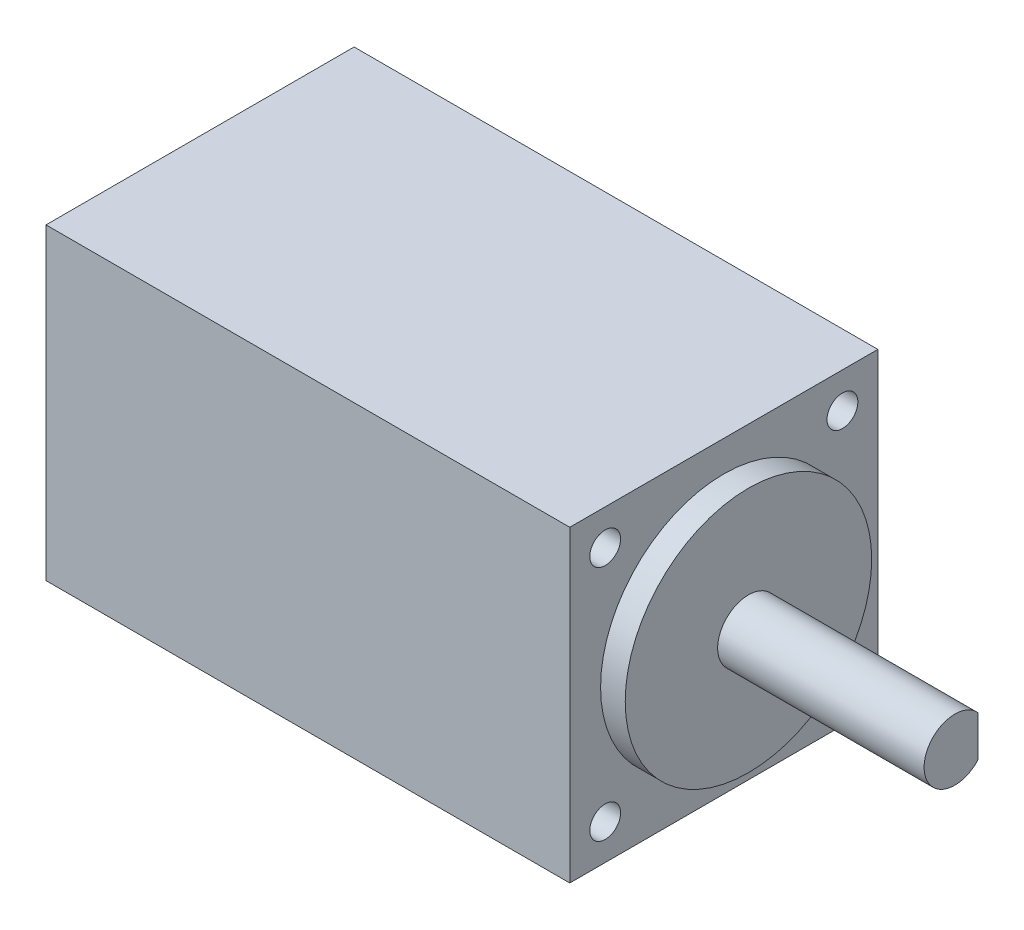
ISO-10303-21;
HEADER;
FILE_DESCRIPTION(('STEP AP214'),'2;1');
FILE_NAME('part.step','',(''),(''),'','','');
FILE_SCHEMA(('AUTOMOTIVE_DESIGN { 1 0 10303 214 1 1 1 1 }'));
ENDSEC;
DATA;
#1=APPLICATION_CONTEXT('core data for automotive mechanical design processes');
#2=APPLICATION_PROTOCOL_DEFINITION('international standard','automotive_design',2000,#1);
#3=PRODUCT_CONTEXT('',#1,'mechanical');
#4=PRODUCT('Part','Part','',(#3));
#5=PRODUCT_RELATED_PRODUCT_CATEGORY('part','',(#4));
#6=PRODUCT_DEFINITION_FORMATION('','',#4);
#7=PRODUCT_DEFINITION_CONTEXT('part definition',#1,'design');
#8=PRODUCT_DEFINITION('design','',#6,#7);
#9=PRODUCT_DEFINITION_SHAPE('','',#8);
#10=(LENGTH_UNIT() NAMED_UNIT(*) SI_UNIT(.MILLI.,.METRE.));
#11=(NAMED_UNIT(*) PLANE_ANGLE_UNIT() SI_UNIT($,.RADIAN.));
#12=(NAMED_UNIT(*) SI_UNIT($,.STERADIAN.) SOLID_ANGLE_UNIT());
#13=UNCERTAINTY_MEASURE_WITH_UNIT(LENGTH_MEASURE(1.E-05),#10,'distance_accuracy_value','');
#14=(GEOMETRIC_REPRESENTATION_CONTEXT(3) GLOBAL_UNCERTAINTY_ASSIGNED_CONTEXT((#13)) GLOBAL_UNIT_ASSIGNED_CONTEXT((#10,
#11,#12)) REPRESENTATION_CONTEXT('',''));
#15=CARTESIAN_POINT('',(0.,0.,0.));
#16=DIRECTION('',(0.,0.,1.));
#17=DIRECTION('',(1.,0.,0.));
#18=AXIS2_PLACEMENT_3D('',#15,#16,#17);
#19=CARTESIAN_POINT('',(49.,10.,-10.));
#20=DIRECTION('',(-1.,0.,0.));
#21=DIRECTION('',(0.,0.,1.));
#22=AXIS2_PLACEMENT_3D('',#19,#20,#21);
#23=CYLINDRICAL_SURFACE('',#22,2.);
#24=CARTESIAN_POINT('',(35.6,10.,-10.));
#25=DIRECTION('',(1.,0.,0.));
#26=DIRECTION('',(0.,0.,-1.));
#27=AXIS2_PLACEMENT_3D('',#24,#25,#26);
#28=CIRCLE('',#27,2.);
#29=CARTESIAN_POINT('',(35.6,10.,-12.));
#30=VERTEX_POINT('',#29);
#31=EDGE_CURVE('E11',#30,#30,#28,.T.);
#32=ORIENTED_EDGE('',*,*,#31,.T.);
#33=EDGE_LOOP('',(#32));
#34=FACE_BOUND('',#33,.T.);
#35=DIRECTION('',(1.,0.,0.));
#36=VECTOR('',#35,1.);
#37=CARTESIAN_POINT('',(40.,8.67712434446771,-11.5));
#38=LINE('',#37,#36);
#39=CARTESIAN_POINT('',(40.,8.67712434446771,-11.5));
#40=VERTEX_POINT('',#39);
#41=CARTESIAN_POINT('',(49.,8.67712434446771,-11.5));
#42=VERTEX_POINT('',#41);
#43=EDGE_CURVE('E103',#40,#42,#38,.T.);
#44=ORIENTED_EDGE('',*,*,#43,.T.);
#45=CARTESIAN_POINT('',(49.,10.,-10.));
#46=DIRECTION('',(1.,0.,0.));
#47=DIRECTION('',(0.,0.,-1.));
#48=AXIS2_PLACEMENT_3D('',#45,#46,#47);
#49=CIRCLE('',#48,2.);
#50=CARTESIAN_POINT('',(49.,11.3228756555323,-11.5));
#51=VERTEX_POINT('',#50);
#52=EDGE_CURVE('E126',#51,#42,#49,.T.);
#53=ORIENTED_EDGE('',*,*,#52,.F.);
#54=DIRECTION('',(1.,0.,0.));
#55=VECTOR('',#54,1.);
#56=CARTESIAN_POINT('',(40.,11.3228756555323,-11.5));
#57=LINE('',#56,#55);
#58=CARTESIAN_POINT('',(40.,11.3228756555323,-11.5));
#59=VERTEX_POINT('',#58);
#60=EDGE_CURVE('E57',#59,#51,#57,.T.);
#61=ORIENTED_EDGE('',*,*,#60,.F.);
#62=CARTESIAN_POINT('',(40.,10.,-10.));
#63=DIRECTION('',(1.,0.,0.));
#64=DIRECTION('',(0.,0.,-1.));
#65=AXIS2_PLACEMENT_3D('',#62,#63,#64);
#66=CIRCLE('',#65,2.);
#67=EDGE_CURVE('E114',#40,#59,#66,.T.);
#68=ORIENTED_EDGE('',*,*,#67,.F.);
#69=EDGE_LOOP('',(#44,#53,#61,#68));
#70=FACE_BOUND('',#69,.T.);
#71=ADVANCED_FACE('F39',(#34,#70),#23,.T.);
#72=CARTESIAN_POINT('',(49.,10.,-10.));
#73=DIRECTION('',(1.,0.,0.));
#74=DIRECTION('',(0.,0.,-1.));
#75=AXIS2_PLACEMENT_3D('',#72,#73,#74);
#76=PLANE('',#75);
#77=ORIENTED_EDGE('',*,*,#52,.T.);
#78=DIRECTION('',(0.,1.,0.));
#79=VECTOR('',#78,1.);
#80=CARTESIAN_POINT('',(49.,0.,-11.5));
#81=LINE('',#80,#79);
#82=EDGE_CURVE('E108',#42,#51,#81,.T.);
#83=ORIENTED_EDGE('',*,*,#82,.T.);
#84=EDGE_LOOP('',(#77,#83));
#85=FACE_BOUND('',#84,.T.);
#86=ADVANCED_FACE('F217',(#85),#76,.T.);
#87=CARTESIAN_POINT('',(34.,0.,0.));
#88=DIRECTION('',(-1.,0.,0.));
#89=DIRECTION('',(0.,0.,1.));
#90=AXIS2_PLACEMENT_3D('',#87,#88,#89);
#91=PLANE('',#90);
#92=CARTESIAN_POINT('',(34.,10.,-10.));
#93=DIRECTION('',(1.,0.,0.));
#94=DIRECTION('',(0.,0.,-1.));
#95=AXIS2_PLACEMENT_3D('',#92,#93,#94);
#96=CIRCLE('',#95,8.);
#97=CARTESIAN_POINT('',(34.,10.,-18.));
#98=VERTEX_POINT('',#97);
#99=EDGE_CURVE('E49',#98,#98,#96,.T.);
#100=ORIENTED_EDGE('',*,*,#99,.F.);
#101=EDGE_LOOP('',(#100));
#102=FACE_BOUND('',#101,.T.);
#103=DIRECTION('',(0.,-1.,0.));
#104=VECTOR('',#103,1.);
#105=CARTESIAN_POINT('',(34.,0.,0.));
#106=LINE('',#105,#104);
#107=CARTESIAN_POINT('',(34.,20.,0.));
#108=VERTEX_POINT('',#107);
#109=CARTESIAN_POINT('',(34.,0.,0.));
#110=VERTEX_POINT('',#109);
#111=EDGE_CURVE('E170',#108,#110,#106,.T.);
#112=ORIENTED_EDGE('',*,*,#111,.T.);
#113=DIRECTION('',(0.,0.,-1.));
#114=VECTOR('',#113,1.);
#115=CARTESIAN_POINT('',(34.,0.,0.));
#116=LINE('',#115,#114);
#117=CARTESIAN_POINT('',(34.,0.,-20.));
#118=VERTEX_POINT('',#117);
#119=EDGE_CURVE('E95',#110,#118,#116,.T.);
#120=ORIENTED_EDGE('',*,*,#119,.T.);
#121=DIRECTION('',(0.,1.,0.));
#122=VECTOR('',#121,1.);
#123=CARTESIAN_POINT('',(34.,0.,-20.));
#124=LINE('',#123,#122);
#125=CARTESIAN_POINT('',(34.,20.,-20.));
#126=VERTEX_POINT('',#125);
#127=EDGE_CURVE('E175',#118,#126,#124,.T.);
#128=ORIENTED_EDGE('',*,*,#127,.T.);
#129=DIRECTION('',(0.,0.,1.));
#130=VECTOR('',#129,1.);
#131=CARTESIAN_POINT('',(34.,20.,0.));
#132=LINE('',#131,#130);
#133=EDGE_CURVE('E66',#126,#108,#132,.T.);
#134=ORIENTED_EDGE('',*,*,#133,.T.);
#135=EDGE_LOOP('',(#112,#120,#128,#134));
#136=FACE_BOUND('',#135,.T.);
#137=CARTESIAN_POINT('',(34.,17.7,-2.3));
#138=DIRECTION('',(1.,0.,0.));
#139=DIRECTION('',(0.,0.,-1.));
#140=AXIS2_PLACEMENT_3D('',#137,#138,#139);
#141=CIRCLE('',#140,1.);
#142=CARTESIAN_POINT('',(34.,17.7,-3.3));
#143=VERTEX_POINT('',#142);
#144=EDGE_CURVE('E162',#143,#143,#141,.T.);
#145=ORIENTED_EDGE('',*,*,#144,.F.);
#146=EDGE_LOOP('',(#145));
#147=FACE_BOUND('',#146,.T.);
#148=CARTESIAN_POINT('',(34.,17.7,-17.7));
#149=DIRECTION('',(1.,0.,0.));
#150=DIRECTION('',(0.,0.,-1.));
#151=AXIS2_PLACEMENT_3D('',#148,#149,#150);
#152=CIRCLE('',#151,1.);
#153=CARTESIAN_POINT('',(34.,17.7,-18.7));
#154=VERTEX_POINT('',#153);
#155=EDGE_CURVE('E154',#154,#154,#152,.T.);
#156=ORIENTED_EDGE('',*,*,#155,.F.);
#157=EDGE_LOOP('',(#156));
#158=FACE_BOUND('',#157,.T.);
#159=CARTESIAN_POINT('',(34.,2.3,-2.3));
#160=DIRECTION('',(1.,0.,0.));
#161=DIRECTION('',(0.,0.,-1.));
#162=AXIS2_PLACEMENT_3D('',#159,#160,#161);
#163=CIRCLE('',#162,1.);
#164=CARTESIAN_POINT('',(34.,2.3,-3.3));
#165=VERTEX_POINT('',#164);
#166=EDGE_CURVE('E146',#165,#165,#163,.T.);
#167=ORIENTED_EDGE('',*,*,#166,.F.);
#168=EDGE_LOOP('',(#167));
#169=FACE_BOUND('',#168,.T.);
#170=CARTESIAN_POINT('',(34.,2.29856671593075,-17.6999999999999));
#171=DIRECTION('',(1.,0.,0.));
#172=DIRECTION('',(0.,0.,-1.));
#173=AXIS2_PLACEMENT_3D('',#170,#171,#172);
#174=CIRCLE('',#173,1.);
#175=CARTESIAN_POINT('',(34.,2.29856671593075,-18.6999999999999));
#176=VERTEX_POINT('',#175);
#177=EDGE_CURVE('E138',#176,#176,#174,.T.);
#178=ORIENTED_EDGE('',*,*,#177,.F.);
#179=EDGE_LOOP('',(#178));
#180=FACE_BOUND('',#179,.T.);
#181=ADVANCED_FACE('F214',(#102,#136,#147,#158,#169,#180),#91,.F.);
#182=CARTESIAN_POINT('',(0.,0.,0.));
#183=DIRECTION('',(-1.,0.,0.));
#184=DIRECTION('',(0.,0.,1.));
#185=AXIS2_PLACEMENT_3D('',#182,#183,#184);
#186=PLANE('',#185);
#187=CARTESIAN_POINT('',(0.,2.3,-2.3));
#188=DIRECTION('',(1.,0.,0.));
#189=DIRECTION('',(0.,0.,-1.));
#190=AXIS2_PLACEMENT_3D('',#187,#188,#189);
#191=CIRCLE('',#190,1.);
#192=CARTESIAN_POINT('',(0.,2.3,-3.3));
#193=VERTEX_POINT('',#192);
#194=EDGE_CURVE('E142',#193,#193,#191,.T.);
#195=ORIENTED_EDGE('',*,*,#194,.T.);
#196=EDGE_LOOP('',(#195));
#197=FACE_BOUND('',#196,.T.);
#198=CARTESIAN_POINT('',(0.,17.7,-2.3));
#199=DIRECTION('',(1.,0.,0.));
#200=DIRECTION('',(0.,0.,-1.));
#201=AXIS2_PLACEMENT_3D('',#198,#199,#200);
#202=CIRCLE('',#201,1.);
#203=CARTESIAN_POINT('',(0.,17.7,-3.3));
#204=VERTEX_POINT('',#203);
#205=EDGE_CURVE('E158',#204,#204,#202,.T.);
#206=ORIENTED_EDGE('',*,*,#205,.T.);
#207=EDGE_LOOP('',(#206));
#208=FACE_BOUND('',#207,.T.);
#209=DIRECTION('',(0.,-1.,0.));
#210=VECTOR('',#209,1.);
#211=CARTESIAN_POINT('',(0.,0.,0.));
#212=LINE('',#211,#210);
#213=CARTESIAN_POINT('',(0.,20.,0.));
#214=VERTEX_POINT('',#213);
#215=CARTESIAN_POINT('',(0.,0.,0.));
#216=VERTEX_POINT('',#215);
#217=EDGE_CURVE('E166',#214,#216,#212,.T.);
#218=ORIENTED_EDGE('',*,*,#217,.F.);
#219=DIRECTION('',(0.,0.,1.));
#220=VECTOR('',#219,1.);
#221=CARTESIAN_POINT('',(0.,20.,0.));
#222=LINE('',#221,#220);
#223=CARTESIAN_POINT('',(0.,20.,-20.));
#224=VERTEX_POINT('',#223);
#225=EDGE_CURVE('E87',#224,#214,#222,.T.);
#226=ORIENTED_EDGE('',*,*,#225,.F.);
#227=DIRECTION('',(0.,1.,0.));
#228=VECTOR('',#227,1.);
#229=CARTESIAN_POINT('',(0.,0.,-20.));
#230=LINE('',#229,#228);
#231=CARTESIAN_POINT('',(0.,0.,-20.));
#232=VERTEX_POINT('',#231);
#233=EDGE_CURVE('E187',#232,#224,#230,.T.);
#234=ORIENTED_EDGE('',*,*,#233,.F.);
#235=DIRECTION('',(0.,0.,-1.));
#236=VECTOR('',#235,1.);
#237=CARTESIAN_POINT('',(0.,0.,0.));
#238=LINE('',#237,#236);
#239=EDGE_CURVE('E184',#216,#232,#238,.T.);
#240=ORIENTED_EDGE('',*,*,#239,.F.);
#241=EDGE_LOOP('',(#218,#226,#234,#240));
#242=FACE_BOUND('',#241,.T.);
#243=CARTESIAN_POINT('',(0.,17.7,-17.7));
#244=DIRECTION('',(1.,0.,0.));
#245=DIRECTION('',(0.,0.,-1.));
#246=AXIS2_PLACEMENT_3D('',#243,#244,#245);
#247=CIRCLE('',#246,1.);
#248=CARTESIAN_POINT('',(0.,17.7,-18.7));
#249=VERTEX_POINT('',#248);
#250=EDGE_CURVE('E150',#249,#249,#247,.T.);
#251=ORIENTED_EDGE('',*,*,#250,.T.);
#252=EDGE_LOOP('',(#251));
#253=FACE_BOUND('',#252,.T.);
#254=CARTESIAN_POINT('',(0.,2.29856671593075,-17.6999999999999));
#255=DIRECTION('',(1.,0.,0.));
#256=DIRECTION('',(0.,0.,-1.));
#257=AXIS2_PLACEMENT_3D('',#254,#255,#256);
#258=CIRCLE('',#257,1.);
#259=CARTESIAN_POINT('',(0.,2.29856671593075,-18.6999999999999));
#260=VERTEX_POINT('',#259);
#261=EDGE_CURVE('E134',#260,#260,#258,.T.);
#262=ORIENTED_EDGE('',*,*,#261,.T.);
#263=EDGE_LOOP('',(#262));
#264=FACE_BOUND('',#263,.T.);
#265=ADVANCED_FACE('F209',(#197,#208,#242,#253,#264),#186,.T.);
#266=CARTESIAN_POINT('',(34.,0.,0.));
#267=DIRECTION('',(0.,0.,-1.));
#268=DIRECTION('',(-1.,0.,0.));
#269=AXIS2_PLACEMENT_3D('',#266,#267,#268);
#270=PLANE('',#269);
#271=ORIENTED_EDGE('',*,*,#217,.T.);
#272=DIRECTION('',(-1.,0.,0.));
#273=VECTOR('',#272,1.);
#274=CARTESIAN_POINT('',(34.,0.,0.));
#275=LINE('',#274,#273);
#276=EDGE_CURVE('E43',#110,#216,#275,.T.);
#277=ORIENTED_EDGE('',*,*,#276,.F.);
#278=ORIENTED_EDGE('',*,*,#111,.F.);
#279=DIRECTION('',(-1.,0.,0.));
#280=VECTOR('',#279,1.);
#281=CARTESIAN_POINT('',(34.,20.,0.));
#282=LINE('',#281,#280);
#283=EDGE_CURVE('E180',#108,#214,#282,.T.);
#284=ORIENTED_EDGE('',*,*,#283,.T.);
#285=EDGE_LOOP('',(#271,#277,#278,#284));
#286=FACE_BOUND('',#285,.T.);
#287=ADVANCED_FACE('F41',(#286),#270,.F.);
#288=CARTESIAN_POINT('',(34.,0.,0.));
#289=DIRECTION('',(0.,1.,0.));
#290=DIRECTION('',(0.,0.,1.));
#291=AXIS2_PLACEMENT_3D('',#288,#289,#290);
#292=PLANE('',#291);
#293=ORIENTED_EDGE('',*,*,#239,.T.);
#294=DIRECTION('',(-1.,0.,0.));
#295=VECTOR('',#294,1.);
#296=CARTESIAN_POINT('',(34.,0.,-20.));
#297=LINE('',#296,#295);
#298=EDGE_CURVE('E196',#118,#232,#297,.T.);
#299=ORIENTED_EDGE('',*,*,#298,.F.);
#300=ORIENTED_EDGE('',*,*,#119,.F.);
#301=ORIENTED_EDGE('',*,*,#276,.T.);
#302=EDGE_LOOP('',(#293,#299,#300,#301));
#303=FACE_BOUND('',#302,.T.);
#304=ADVANCED_FACE('F204',(#303),#292,.F.);
#305=CARTESIAN_POINT('',(34.,0.,-20.));
#306=DIRECTION('',(0.,0.,1.));
#307=DIRECTION('',(1.,0.,0.));
#308=AXIS2_PLACEMENT_3D('',#305,#306,#307);
#309=PLANE('',#308);
#310=ORIENTED_EDGE('',*,*,#233,.T.);
#311=DIRECTION('',(-1.,0.,0.));
#312=VECTOR('',#311,1.);
#313=CARTESIAN_POINT('',(34.,20.,-20.));
#314=LINE('',#313,#312);
#315=EDGE_CURVE('E194',#126,#224,#314,.T.);
#316=ORIENTED_EDGE('',*,*,#315,.F.);
#317=ORIENTED_EDGE('',*,*,#127,.F.);
#318=ORIENTED_EDGE('',*,*,#298,.T.);
#319=EDGE_LOOP('',(#310,#316,#317,#318));
#320=FACE_BOUND('',#319,.T.);
#321=ADVANCED_FACE('F212',(#320),#309,.F.);
#322=CARTESIAN_POINT('',(34.,20.,0.));
#323=DIRECTION('',(0.,-1.,0.));
#324=DIRECTION('',(0.,0.,-1.));
#325=AXIS2_PLACEMENT_3D('',#322,#323,#324);
#326=PLANE('',#325);
#327=ORIENTED_EDGE('',*,*,#225,.T.);
#328=ORIENTED_EDGE('',*,*,#283,.F.);
#329=ORIENTED_EDGE('',*,*,#133,.F.);
#330=ORIENTED_EDGE('',*,*,#315,.T.);
#331=EDGE_LOOP('',(#327,#328,#329,#330));
#332=FACE_BOUND('',#331,.T.);
#333=ADVANCED_FACE('F213',(#332),#326,.F.);
#334=CARTESIAN_POINT('',(34.,17.7,-2.3));
#335=DIRECTION('',(-1.,0.,0.));
#336=DIRECTION('',(0.,0.,1.));
#337=AXIS2_PLACEMENT_3D('',#334,#335,#336);
#338=CYLINDRICAL_SURFACE('',#337,1.);
#339=ORIENTED_EDGE('',*,*,#144,.T.);
#340=EDGE_LOOP('',(#339));
#341=FACE_BOUND('',#340,.T.);
#342=ORIENTED_EDGE('',*,*,#205,.F.);
#343=EDGE_LOOP('',(#342));
#344=FACE_BOUND('',#343,.T.);
#345=ADVANCED_FACE('F267',(#341,#344),#338,.F.);
#346=CARTESIAN_POINT('',(34.,17.7,-17.7));
#347=DIRECTION('',(-1.,0.,0.));
#348=DIRECTION('',(0.,0.,1.));
#349=AXIS2_PLACEMENT_3D('',#346,#347,#348);
#350=CYLINDRICAL_SURFACE('',#349,1.);
#351=ORIENTED_EDGE('',*,*,#155,.T.);
#352=EDGE_LOOP('',(#351));
#353=FACE_BOUND('',#352,.T.);
#354=ORIENTED_EDGE('',*,*,#250,.F.);
#355=EDGE_LOOP('',(#354));
#356=FACE_BOUND('',#355,.T.);
#357=ADVANCED_FACE('F263',(#353,#356),#350,.F.);
#358=CARTESIAN_POINT('',(34.,2.3,-2.3));
#359=DIRECTION('',(-1.,0.,0.));
#360=DIRECTION('',(0.,0.,1.));
#361=AXIS2_PLACEMENT_3D('',#358,#359,#360);
#362=CYLINDRICAL_SURFACE('',#361,1.);
#363=ORIENTED_EDGE('',*,*,#166,.T.);
#364=EDGE_LOOP('',(#363));
#365=FACE_BOUND('',#364,.T.);
#366=ORIENTED_EDGE('',*,*,#194,.F.);
#367=EDGE_LOOP('',(#366));
#368=FACE_BOUND('',#367,.T.);
#369=ADVANCED_FACE('F232',(#365,#368),#362,.F.);
#370=CARTESIAN_POINT('',(34.,2.29856671593075,-17.6999999999999));
#371=DIRECTION('',(-1.,0.,0.));
#372=DIRECTION('',(0.,0.,1.));
#373=AXIS2_PLACEMENT_3D('',#370,#371,#372);
#374=CYLINDRICAL_SURFACE('',#373,1.);
#375=ORIENTED_EDGE('',*,*,#177,.T.);
#376=EDGE_LOOP('',(#375));
#377=FACE_BOUND('',#376,.T.);
#378=ORIENTED_EDGE('',*,*,#261,.F.);
#379=EDGE_LOOP('',(#378));
#380=FACE_BOUND('',#379,.T.);
#381=ADVANCED_FACE('F228',(#377,#380),#374,.F.);
#382=CARTESIAN_POINT('',(35.6,10.,-10.));
#383=DIRECTION('',(-1.,0.,0.));
#384=DIRECTION('',(0.,0.,1.));
#385=AXIS2_PLACEMENT_3D('',#382,#383,#384);
#386=CYLINDRICAL_SURFACE('',#385,8.);
#387=CARTESIAN_POINT('',(35.6,10.,-10.));
#388=DIRECTION('',(1.,0.,0.));
#389=DIRECTION('',(0.,0.,-1.));
#390=AXIS2_PLACEMENT_3D('',#387,#388,#389);
#391=CIRCLE('',#390,8.);
#392=CARTESIAN_POINT('',(35.6,10.,-18.));
#393=VERTEX_POINT('',#392);
#394=EDGE_CURVE('E129',#393,#393,#391,.T.);
#395=ORIENTED_EDGE('',*,*,#394,.F.);
#396=EDGE_LOOP('',(#395));
#397=FACE_BOUND('',#396,.T.);
#398=ORIENTED_EDGE('',*,*,#99,.T.);
#399=EDGE_LOOP('',(#398));
#400=FACE_BOUND('',#399,.T.);
#401=ADVANCED_FACE('F231',(#397,#400),#386,.T.);
#402=CARTESIAN_POINT('',(35.6,10.,-10.));
#403=DIRECTION('',(1.,0.,0.));
#404=DIRECTION('',(0.,0.,-1.));
#405=AXIS2_PLACEMENT_3D('',#402,#403,#404);
#406=PLANE('',#405);
#407=ORIENTED_EDGE('',*,*,#31,.F.);
#408=EDGE_LOOP('',(#407));
#409=FACE_BOUND('',#408,.T.);
#410=ORIENTED_EDGE('',*,*,#394,.T.);
#411=EDGE_LOOP('',(#410));
#412=FACE_BOUND('',#411,.T.);
#413=ADVANCED_FACE('F254',(#409,#412),#406,.T.);
#414=CARTESIAN_POINT('',(40.,0.,-11.5));
#415=DIRECTION('',(0.,0.,-1.));
#416=DIRECTION('',(-1.,0.,0.));
#417=AXIS2_PLACEMENT_3D('',#414,#415,#416);
#418=PLANE('',#417);
#419=ORIENTED_EDGE('',*,*,#82,.F.);
#420=ORIENTED_EDGE('',*,*,#43,.F.);
#421=DIRECTION('',(0.,1.,0.));
#422=VECTOR('',#421,1.);
#423=CARTESIAN_POINT('',(40.,0.,-11.5));
#424=LINE('',#423,#422);
#425=EDGE_CURVE('E106',#40,#59,#424,.T.);
#426=ORIENTED_EDGE('',*,*,#425,.T.);
#427=ORIENTED_EDGE('',*,*,#60,.T.);
#428=EDGE_LOOP('',(#419,#420,#426,#427));
#429=FACE_BOUND('',#428,.T.);
#430=ADVANCED_FACE('F105',(#429),#418,.T.);
#431=CARTESIAN_POINT('',(40.,0.,0.));
#432=DIRECTION('',(1.,0.,0.));
#433=DIRECTION('',(0.,0.,-1.));
#434=AXIS2_PLACEMENT_3D('',#431,#432,#433);
#435=PLANE('',#434);
#436=ORIENTED_EDGE('',*,*,#425,.F.);
#437=ORIENTED_EDGE('',*,*,#67,.T.);
#438=EDGE_LOOP('',(#436,#437));
#439=FACE_BOUND('',#438,.T.);
#440=ADVANCED_FACE('F117',(#439),#435,.T.);
#441=CLOSED_SHELL('',(#71,#86,#181,#265,#287,#304,#321,#333,#345,#357,#369,#381,#401,#413,#430,#440));
#442=MANIFOLD_SOLID_BREP('B2',#441);
#443=ADVANCED_BREP_SHAPE_REPRESENTATION('',(#18,#442),#14);
#444=SHAPE_DEFINITION_REPRESENTATION(#9,#443);
ENDSEC;
END-ISO-10303-21;
